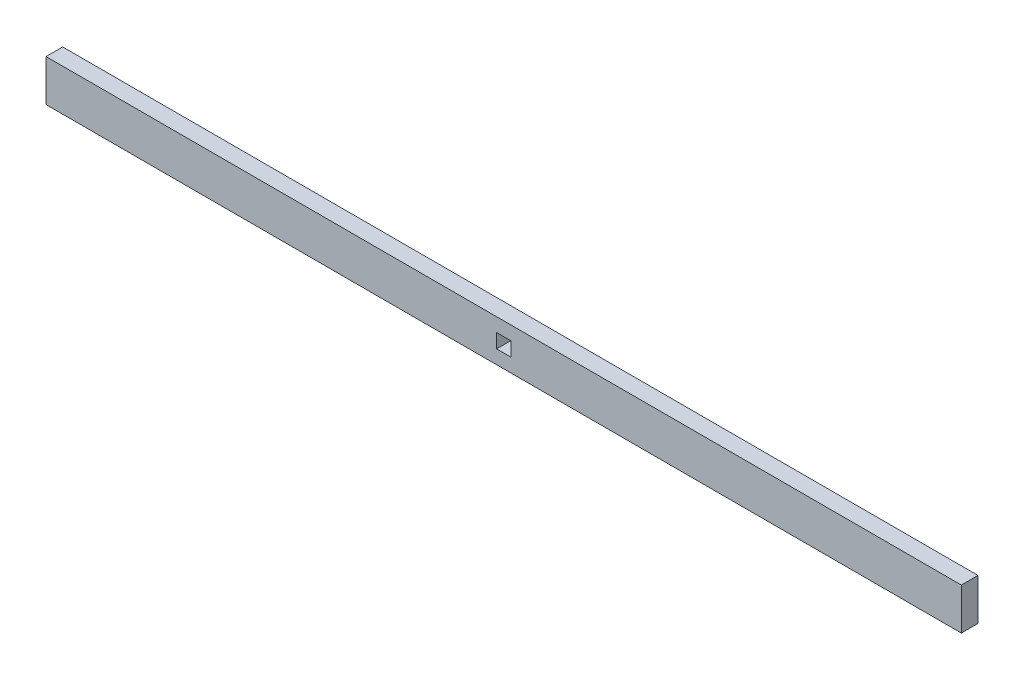
ISO-10303-21;
HEADER;
FILE_DESCRIPTION(('STEP AP214'),'2;1');
FILE_NAME('part.step','',(''),(''),'','','');
FILE_SCHEMA(('AUTOMOTIVE_DESIGN { 1 0 10303 214 1 1 1 1 }'));
ENDSEC;
DATA;
#1=APPLICATION_CONTEXT('core data for automotive mechanical design processes');
#2=APPLICATION_PROTOCOL_DEFINITION('international standard','automotive_design',2000,#1);
#3=PRODUCT_CONTEXT('',#1,'mechanical');
#4=PRODUCT('Part','Part','',(#3));
#5=PRODUCT_RELATED_PRODUCT_CATEGORY('part','',(#4));
#6=PRODUCT_DEFINITION_FORMATION('','',#4);
#7=PRODUCT_DEFINITION_CONTEXT('part definition',#1,'design');
#8=PRODUCT_DEFINITION('design','',#6,#7);
#9=PRODUCT_DEFINITION_SHAPE('','',#8);
#10=(LENGTH_UNIT() NAMED_UNIT(*) SI_UNIT(.MILLI.,.METRE.));
#11=(NAMED_UNIT(*) PLANE_ANGLE_UNIT() SI_UNIT($,.RADIAN.));
#12=(NAMED_UNIT(*) SI_UNIT($,.STERADIAN.) SOLID_ANGLE_UNIT());
#13=UNCERTAINTY_MEASURE_WITH_UNIT(LENGTH_MEASURE(1.E-05),#10,'distance_accuracy_value','');
#14=(GEOMETRIC_REPRESENTATION_CONTEXT(3) GLOBAL_UNCERTAINTY_ASSIGNED_CONTEXT((#13)) GLOBAL_UNIT_ASSIGNED_CONTEXT((#10,
#11,#12)) REPRESENTATION_CONTEXT('',''));
#15=CARTESIAN_POINT('',(0.,0.,0.));
#16=DIRECTION('',(0.,0.,1.));
#17=DIRECTION('',(1.,0.,0.));
#18=AXIS2_PLACEMENT_3D('',#15,#16,#17);
#19=CARTESIAN_POINT('',(550.,25.,20.));
#20=DIRECTION('',(-1.,0.,0.));
#21=DIRECTION('',(0.,0.,1.));
#22=AXIS2_PLACEMENT_3D('',#19,#20,#21);
#23=PLANE('',#22);
#24=DIRECTION('',(0.,1.,0.));
#25=VECTOR('',#24,1.);
#26=CARTESIAN_POINT('',(550.,25.,0.));
#27=LINE('',#26,#25);
#28=CARTESIAN_POINT('',(550.,-25.,0.));
#29=VERTEX_POINT('',#28);
#30=CARTESIAN_POINT('',(550.,25.,0.));
#31=VERTEX_POINT('',#30);
#32=EDGE_CURVE('E157',#29,#31,#27,.T.);
#33=ORIENTED_EDGE('',*,*,#32,.T.);
#34=DIRECTION('',(0.,0.,-1.));
#35=VECTOR('',#34,1.);
#36=CARTESIAN_POINT('',(550.,25.,20.));
#37=LINE('',#36,#35);
#38=CARTESIAN_POINT('',(550.,25.,20.));
#39=VERTEX_POINT('',#38);
#40=EDGE_CURVE('E11',#39,#31,#37,.T.);
#41=ORIENTED_EDGE('',*,*,#40,.F.);
#42=DIRECTION('',(0.,1.,0.));
#43=VECTOR('',#42,1.);
#44=CARTESIAN_POINT('',(550.,25.,20.));
#45=LINE('',#44,#43);
#46=CARTESIAN_POINT('',(550.,-25.,20.));
#47=VERTEX_POINT('',#46);
#48=EDGE_CURVE('E163',#47,#39,#45,.T.);
#49=ORIENTED_EDGE('',*,*,#48,.F.);
#50=DIRECTION('',(0.,0.,-1.));
#51=VECTOR('',#50,1.);
#52=CARTESIAN_POINT('',(550.,-25.,20.));
#53=LINE('',#52,#51);
#54=EDGE_CURVE('E173',#47,#29,#53,.T.);
#55=ORIENTED_EDGE('',*,*,#54,.T.);
#56=EDGE_LOOP('',(#33,#41,#49,#55));
#57=FACE_BOUND('',#56,.T.);
#58=ADVANCED_FACE('F38',(#57),#23,.F.);
#59=CARTESIAN_POINT('',(-550.,25.,20.));
#60=DIRECTION('',(0.,-1.,0.));
#61=DIRECTION('',(0.,0.,-1.));
#62=AXIS2_PLACEMENT_3D('',#59,#60,#61);
#63=PLANE('',#62);
#64=DIRECTION('',(-1.,0.,0.));
#65=VECTOR('',#64,1.);
#66=CARTESIAN_POINT('',(-550.,25.,0.));
#67=LINE('',#66,#65);
#68=CARTESIAN_POINT('',(-550.,25.,0.));
#69=VERTEX_POINT('',#68);
#70=EDGE_CURVE('E177',#31,#69,#67,.T.);
#71=ORIENTED_EDGE('',*,*,#70,.T.);
#72=DIRECTION('',(0.,0.,-1.));
#73=VECTOR('',#72,1.);
#74=CARTESIAN_POINT('',(-550.,25.,20.));
#75=LINE('',#74,#73);
#76=CARTESIAN_POINT('',(-550.,25.,20.));
#77=VERTEX_POINT('',#76);
#78=EDGE_CURVE('E46',#77,#69,#75,.T.);
#79=ORIENTED_EDGE('',*,*,#78,.F.);
#80=DIRECTION('',(-1.,0.,0.));
#81=VECTOR('',#80,1.);
#82=CARTESIAN_POINT('',(-550.,25.,20.));
#83=LINE('',#82,#81);
#84=EDGE_CURVE('E90',#39,#77,#83,.T.);
#85=ORIENTED_EDGE('',*,*,#84,.F.);
#86=ORIENTED_EDGE('',*,*,#40,.T.);
#87=EDGE_LOOP('',(#71,#79,#85,#86));
#88=FACE_BOUND('',#87,.T.);
#89=ADVANCED_FACE('F213',(#88),#63,.F.);
#90=CARTESIAN_POINT('',(-550.,25.,20.));
#91=DIRECTION('',(1.,0.,0.));
#92=DIRECTION('',(0.,0.,-1.));
#93=AXIS2_PLACEMENT_3D('',#90,#91,#92);
#94=PLANE('',#93);
#95=DIRECTION('',(0.,-1.,0.));
#96=VECTOR('',#95,1.);
#97=CARTESIAN_POINT('',(-550.,25.,0.));
#98=LINE('',#97,#96);
#99=CARTESIAN_POINT('',(-550.,-25.,0.));
#100=VERTEX_POINT('',#99);
#101=EDGE_CURVE('E180',#69,#100,#98,.T.);
#102=ORIENTED_EDGE('',*,*,#101,.T.);
#103=DIRECTION('',(0.,0.,-1.));
#104=VECTOR('',#103,1.);
#105=CARTESIAN_POINT('',(-550.,-25.,20.));
#106=LINE('',#105,#104);
#107=CARTESIAN_POINT('',(-550.,-25.,20.));
#108=VERTEX_POINT('',#107);
#109=EDGE_CURVE('E187',#108,#100,#106,.T.);
#110=ORIENTED_EDGE('',*,*,#109,.F.);
#111=DIRECTION('',(0.,-1.,0.));
#112=VECTOR('',#111,1.);
#113=CARTESIAN_POINT('',(-550.,25.,20.));
#114=LINE('',#113,#112);
#115=EDGE_CURVE('E168',#77,#108,#114,.T.);
#116=ORIENTED_EDGE('',*,*,#115,.F.);
#117=ORIENTED_EDGE('',*,*,#78,.T.);
#118=EDGE_LOOP('',(#102,#110,#116,#117));
#119=FACE_BOUND('',#118,.T.);
#120=ADVANCED_FACE('F194',(#119),#94,.F.);
#121=CARTESIAN_POINT('',(-550.,-25.,20.));
#122=DIRECTION('',(0.,1.,0.));
#123=DIRECTION('',(0.,0.,1.));
#124=AXIS2_PLACEMENT_3D('',#121,#122,#123);
#125=PLANE('',#124);
#126=DIRECTION('',(1.,0.,0.));
#127=VECTOR('',#126,1.);
#128=CARTESIAN_POINT('',(-550.,-25.,0.));
#129=LINE('',#128,#127);
#130=EDGE_CURVE('E83',#100,#29,#129,.T.);
#131=ORIENTED_EDGE('',*,*,#130,.T.);
#132=ORIENTED_EDGE('',*,*,#54,.F.);
#133=DIRECTION('',(1.,0.,0.));
#134=VECTOR('',#133,1.);
#135=CARTESIAN_POINT('',(-550.,-25.,20.));
#136=LINE('',#135,#134);
#137=EDGE_CURVE('E62',#108,#47,#136,.T.);
#138=ORIENTED_EDGE('',*,*,#137,.F.);
#139=ORIENTED_EDGE('',*,*,#109,.T.);
#140=EDGE_LOOP('',(#131,#132,#138,#139));
#141=FACE_BOUND('',#140,.T.);
#142=ADVANCED_FACE('F202',(#141),#125,.F.);
#143=CARTESIAN_POINT('',(0.,0.,20.));
#144=DIRECTION('',(0.,0.,1.));
#145=DIRECTION('',(1.,0.,0.));
#146=AXIS2_PLACEMENT_3D('',#143,#144,#145);
#147=PLANE('',#146);
#148=DIRECTION('',(0.,1.,0.));
#149=VECTOR('',#148,1.);
#150=CARTESIAN_POINT('',(8.5,8.5,20.));
#151=LINE('',#150,#149);
#152=CARTESIAN_POINT('',(8.5,-8.5,20.));
#153=VERTEX_POINT('',#152);
#154=CARTESIAN_POINT('',(8.5,8.5,20.));
#155=VERTEX_POINT('',#154);
#156=EDGE_CURVE('E53',#153,#155,#151,.T.);
#157=ORIENTED_EDGE('',*,*,#156,.F.);
#158=DIRECTION('',(1.,0.,0.));
#159=VECTOR('',#158,1.);
#160=CARTESIAN_POINT('',(-8.5,-8.5,20.));
#161=LINE('',#160,#159);
#162=CARTESIAN_POINT('',(-8.5,-8.5,20.));
#163=VERTEX_POINT('',#162);
#164=EDGE_CURVE('E135',#163,#153,#161,.T.);
#165=ORIENTED_EDGE('',*,*,#164,.F.);
#166=DIRECTION('',(0.,-1.,0.));
#167=VECTOR('',#166,1.);
#168=CARTESIAN_POINT('',(-8.5,8.5,20.));
#169=LINE('',#168,#167);
#170=CARTESIAN_POINT('',(-8.5,8.5,20.));
#171=VERTEX_POINT('',#170);
#172=EDGE_CURVE('E139',#171,#163,#169,.T.);
#173=ORIENTED_EDGE('',*,*,#172,.F.);
#174=DIRECTION('',(-1.,0.,0.));
#175=VECTOR('',#174,1.);
#176=CARTESIAN_POINT('',(-8.5,8.5,20.));
#177=LINE('',#176,#175);
#178=EDGE_CURVE('E148',#155,#171,#177,.T.);
#179=ORIENTED_EDGE('',*,*,#178,.F.);
#180=EDGE_LOOP('',(#157,#165,#173,#179));
#181=FACE_BOUND('',#180,.T.);
#182=ORIENTED_EDGE('',*,*,#48,.T.);
#183=ORIENTED_EDGE('',*,*,#84,.T.);
#184=ORIENTED_EDGE('',*,*,#115,.T.);
#185=ORIENTED_EDGE('',*,*,#137,.T.);
#186=EDGE_LOOP('',(#182,#183,#184,#185));
#187=FACE_BOUND('',#186,.T.);
#188=ADVANCED_FACE('F204',(#181,#187),#147,.T.);
#189=CARTESIAN_POINT('',(0.,0.,0.));
#190=DIRECTION('',(0.,0.,1.));
#191=DIRECTION('',(1.,0.,0.));
#192=AXIS2_PLACEMENT_3D('',#189,#190,#191);
#193=PLANE('',#192);
#194=ORIENTED_EDGE('',*,*,#32,.F.);
#195=ORIENTED_EDGE('',*,*,#130,.F.);
#196=ORIENTED_EDGE('',*,*,#101,.F.);
#197=ORIENTED_EDGE('',*,*,#70,.F.);
#198=EDGE_LOOP('',(#194,#195,#196,#197));
#199=FACE_BOUND('',#198,.T.);
#200=ADVANCED_FACE('F198',(#199),#193,.F.);
#201=CARTESIAN_POINT('',(8.5,8.5,2.));
#202=DIRECTION('',(1.,0.,0.));
#203=DIRECTION('',(0.,0.,-1.));
#204=AXIS2_PLACEMENT_3D('',#201,#202,#203);
#205=PLANE('',#204);
#206=ORIENTED_EDGE('',*,*,#156,.T.);
#207=DIRECTION('',(0.,0.,1.));
#208=VECTOR('',#207,1.);
#209=CARTESIAN_POINT('',(8.5,8.5,2.));
#210=LINE('',#209,#208);
#211=CARTESIAN_POINT('',(8.5,8.5,2.));
#212=VERTEX_POINT('',#211);
#213=EDGE_CURVE('E110',#212,#155,#210,.T.);
#214=ORIENTED_EDGE('',*,*,#213,.F.);
#215=DIRECTION('',(0.,1.,0.));
#216=VECTOR('',#215,1.);
#217=CARTESIAN_POINT('',(8.5,8.5,2.));
#218=LINE('',#217,#216);
#219=CARTESIAN_POINT('',(8.5,-8.5,2.));
#220=VERTEX_POINT('',#219);
#221=EDGE_CURVE('E114',#220,#212,#218,.T.);
#222=ORIENTED_EDGE('',*,*,#221,.F.);
#223=DIRECTION('',(0.,0.,1.));
#224=VECTOR('',#223,1.);
#225=CARTESIAN_POINT('',(8.5,-8.5,2.));
#226=LINE('',#225,#224);
#227=EDGE_CURVE('E154',#220,#153,#226,.T.);
#228=ORIENTED_EDGE('',*,*,#227,.T.);
#229=EDGE_LOOP('',(#206,#214,#222,#228));
#230=FACE_BOUND('',#229,.T.);
#231=ADVANCED_FACE('F112',(#230),#205,.F.);
#232=CARTESIAN_POINT('',(-8.5,-8.5,2.));
#233=DIRECTION('',(0.,-1.,0.));
#234=DIRECTION('',(0.,0.,-1.));
#235=AXIS2_PLACEMENT_3D('',#232,#233,#234);
#236=PLANE('',#235);
#237=ORIENTED_EDGE('',*,*,#164,.T.);
#238=ORIENTED_EDGE('',*,*,#227,.F.);
#239=DIRECTION('',(1.,0.,0.));
#240=VECTOR('',#239,1.);
#241=CARTESIAN_POINT('',(-8.5,-8.5,2.));
#242=LINE('',#241,#240);
#243=CARTESIAN_POINT('',(-8.5,-8.5,2.));
#244=VERTEX_POINT('',#243);
#245=EDGE_CURVE('E121',#244,#220,#242,.T.);
#246=ORIENTED_EDGE('',*,*,#245,.F.);
#247=DIRECTION('',(0.,0.,1.));
#248=VECTOR('',#247,1.);
#249=CARTESIAN_POINT('',(-8.5,-8.5,2.));
#250=LINE('',#249,#248);
#251=EDGE_CURVE('E158',#244,#163,#250,.T.);
#252=ORIENTED_EDGE('',*,*,#251,.T.);
#253=EDGE_LOOP('',(#237,#238,#246,#252));
#254=FACE_BOUND('',#253,.T.);
#255=ADVANCED_FACE('F249',(#254),#236,.F.);
#256=CARTESIAN_POINT('',(-8.5,8.5,2.));
#257=DIRECTION('',(-1.,0.,0.));
#258=DIRECTION('',(0.,0.,1.));
#259=AXIS2_PLACEMENT_3D('',#256,#257,#258);
#260=PLANE('',#259);
#261=ORIENTED_EDGE('',*,*,#172,.T.);
#262=ORIENTED_EDGE('',*,*,#251,.F.);
#263=DIRECTION('',(0.,-1.,0.));
#264=VECTOR('',#263,1.);
#265=CARTESIAN_POINT('',(-8.5,8.5,2.));
#266=LINE('',#265,#264);
#267=CARTESIAN_POINT('',(-8.5,8.5,2.));
#268=VERTEX_POINT('',#267);
#269=EDGE_CURVE('E130',#268,#244,#266,.T.);
#270=ORIENTED_EDGE('',*,*,#269,.F.);
#271=DIRECTION('',(0.,0.,1.));
#272=VECTOR('',#271,1.);
#273=CARTESIAN_POINT('',(-8.5,8.5,2.));
#274=LINE('',#273,#272);
#275=EDGE_CURVE('E120',#268,#171,#274,.T.);
#276=ORIENTED_EDGE('',*,*,#275,.T.);
#277=EDGE_LOOP('',(#261,#262,#270,#276));
#278=FACE_BOUND('',#277,.T.);
#279=ADVANCED_FACE('F258',(#278),#260,.F.);
#280=CARTESIAN_POINT('',(-8.5,8.5,2.));
#281=DIRECTION('',(0.,1.,0.));
#282=DIRECTION('',(0.,0.,1.));
#283=AXIS2_PLACEMENT_3D('',#280,#281,#282);
#284=PLANE('',#283);
#285=ORIENTED_EDGE('',*,*,#178,.T.);
#286=ORIENTED_EDGE('',*,*,#275,.F.);
#287=DIRECTION('',(-1.,0.,0.));
#288=VECTOR('',#287,1.);
#289=CARTESIAN_POINT('',(-8.5,8.5,2.));
#290=LINE('',#289,#288);
#291=EDGE_CURVE('E124',#212,#268,#290,.T.);
#292=ORIENTED_EDGE('',*,*,#291,.F.);
#293=ORIENTED_EDGE('',*,*,#213,.T.);
#294=EDGE_LOOP('',(#285,#286,#292,#293));
#295=FACE_BOUND('',#294,.T.);
#296=ADVANCED_FACE('F125',(#295),#284,.F.);
#297=CARTESIAN_POINT('',(0.,0.,2.));
#298=DIRECTION('',(0.,0.,1.));
#299=DIRECTION('',(1.,0.,0.));
#300=AXIS2_PLACEMENT_3D('',#297,#298,#299);
#301=PLANE('',#300);
#302=ORIENTED_EDGE('',*,*,#221,.T.);
#303=ORIENTED_EDGE('',*,*,#291,.T.);
#304=ORIENTED_EDGE('',*,*,#269,.T.);
#305=ORIENTED_EDGE('',*,*,#245,.T.);
#306=EDGE_LOOP('',(#302,#303,#304,#305));
#307=FACE_BOUND('',#306,.T.);
#308=ADVANCED_FACE('F132',(#307),#301,.T.);
#309=CLOSED_SHELL('',(#58,#89,#120,#142,#188,#200,#231,#255,#279,#296,#308));
#310=MANIFOLD_SOLID_BREP('B2',#309);
#311=ADVANCED_BREP_SHAPE_REPRESENTATION('',(#18,#310),#14);
#312=SHAPE_DEFINITION_REPRESENTATION(#9,#311);
ENDSEC;
END-ISO-10303-21;
